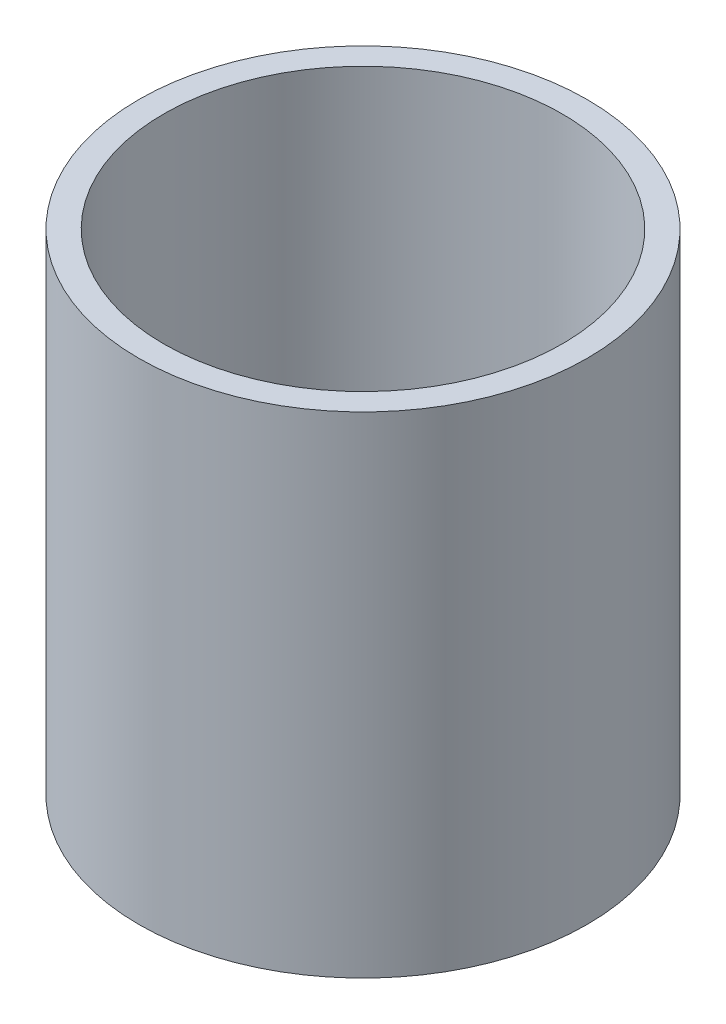
ISO-10303-21;
HEADER;
FILE_DESCRIPTION(('STEP AP214'),'2;1');
FILE_NAME('part.step','',(''),(''),'','','');
FILE_SCHEMA(('AUTOMOTIVE_DESIGN { 1 0 10303 214 1 1 1 1 }'));
ENDSEC;
DATA;
#1=APPLICATION_CONTEXT('core data for automotive mechanical design processes');
#2=APPLICATION_PROTOCOL_DEFINITION('international standard','automotive_design',2000,#1);
#3=PRODUCT_CONTEXT('',#1,'mechanical');
#4=PRODUCT('Part','Part','',(#3));
#5=PRODUCT_RELATED_PRODUCT_CATEGORY('part','',(#4));
#6=PRODUCT_DEFINITION_FORMATION('','',#4);
#7=PRODUCT_DEFINITION_CONTEXT('part definition',#1,'design');
#8=PRODUCT_DEFINITION('design','',#6,#7);
#9=PRODUCT_DEFINITION_SHAPE('','',#8);
#10=(LENGTH_UNIT() NAMED_UNIT(*) SI_UNIT(.MILLI.,.METRE.));
#11=(NAMED_UNIT(*) PLANE_ANGLE_UNIT() SI_UNIT($,.RADIAN.));
#12=(NAMED_UNIT(*) SI_UNIT($,.STERADIAN.) SOLID_ANGLE_UNIT());
#13=UNCERTAINTY_MEASURE_WITH_UNIT(LENGTH_MEASURE(1.E-05),#10,'distance_accuracy_value','');
#14=(GEOMETRIC_REPRESENTATION_CONTEXT(3) GLOBAL_UNCERTAINTY_ASSIGNED_CONTEXT((#13)) GLOBAL_UNIT_ASSIGNED_CONTEXT((#10,
#11,#12)) REPRESENTATION_CONTEXT('',''));
#15=CARTESIAN_POINT('',(0.,0.,0.));
#16=DIRECTION('',(0.,0.,1.));
#17=DIRECTION('',(1.,0.,0.));
#18=AXIS2_PLACEMENT_3D('',#15,#16,#17);
#19=CARTESIAN_POINT('',(0.,50.,0.));
#20=DIRECTION('',(0.,1.,0.));
#21=DIRECTION('',(0.,0.,1.));
#22=AXIS2_PLACEMENT_3D('',#19,#20,#21);
#23=PLANE('',#22);
#24=CARTESIAN_POINT('',(0.,50.,0.));
#25=DIRECTION('',(0.,1.,0.));
#26=DIRECTION('',(0.,0.,1.));
#27=AXIS2_PLACEMENT_3D('',#24,#25,#26);
#28=CIRCLE('',#27,22.86);
#29=CARTESIAN_POINT('',(0.,50.,22.86));
#30=VERTEX_POINT('',#29);
#31=EDGE_CURVE('E10',#30,#30,#28,.T.);
#32=ORIENTED_EDGE('',*,*,#31,.T.);
#33=EDGE_LOOP('',(#32));
#34=FACE_BOUND('',#33,.T.);
#35=CARTESIAN_POINT('',(0.,50.,0.));
#36=DIRECTION('',(0.,1.,0.));
#37=DIRECTION('',(0.,0.,1.));
#38=AXIS2_PLACEMENT_3D('',#35,#36,#37);
#39=CIRCLE('',#38,20.32);
#40=CARTESIAN_POINT('',(0.,50.,20.32));
#41=VERTEX_POINT('',#40);
#42=EDGE_CURVE('E42',#41,#41,#39,.T.);
#43=ORIENTED_EDGE('',*,*,#42,.F.);
#44=EDGE_LOOP('',(#43));
#45=FACE_BOUND('',#44,.T.);
#46=ADVANCED_FACE('F31',(#34,#45),#23,.T.);
#47=CARTESIAN_POINT('',(0.,0.,0.));
#48=DIRECTION('',(0.,1.,0.));
#49=DIRECTION('',(0.,0.,1.));
#50=AXIS2_PLACEMENT_3D('',#47,#48,#49);
#51=PLANE('',#50);
#52=CARTESIAN_POINT('',(0.,0.,0.));
#53=DIRECTION('',(0.,1.,0.));
#54=DIRECTION('',(0.,0.,1.));
#55=AXIS2_PLACEMENT_3D('',#52,#53,#54);
#56=CIRCLE('',#55,22.86);
#57=CARTESIAN_POINT('',(0.,0.,22.86));
#58=VERTEX_POINT('',#57);
#59=EDGE_CURVE('E35',#58,#58,#56,.T.);
#60=ORIENTED_EDGE('',*,*,#59,.F.);
#61=EDGE_LOOP('',(#60));
#62=FACE_BOUND('',#61,.T.);
#63=CARTESIAN_POINT('',(0.,0.,0.));
#64=DIRECTION('',(0.,1.,0.));
#65=DIRECTION('',(0.,0.,1.));
#66=AXIS2_PLACEMENT_3D('',#63,#64,#65);
#67=CIRCLE('',#66,20.32);
#68=CARTESIAN_POINT('',(0.,0.,20.32));
#69=VERTEX_POINT('',#68);
#70=EDGE_CURVE('E44',#69,#69,#67,.T.);
#71=ORIENTED_EDGE('',*,*,#70,.T.);
#72=EDGE_LOOP('',(#71));
#73=FACE_BOUND('',#72,.T.);
#74=ADVANCED_FACE('F54',(#62,#73),#51,.F.);
#75=CARTESIAN_POINT('',(0.,50.,0.));
#76=DIRECTION('',(0.,-1.,0.));
#77=DIRECTION('',(0.,0.,-1.));
#78=AXIS2_PLACEMENT_3D('',#75,#76,#77);
#79=CYLINDRICAL_SURFACE('',#78,22.86);
#80=ORIENTED_EDGE('',*,*,#31,.F.);
#81=EDGE_LOOP('',(#80));
#82=FACE_BOUND('',#81,.T.);
#83=ORIENTED_EDGE('',*,*,#59,.T.);
#84=EDGE_LOOP('',(#83));
#85=FACE_BOUND('',#84,.T.);
#86=ADVANCED_FACE('F33',(#82,#85),#79,.T.);
#87=CARTESIAN_POINT('',(0.,50.,0.));
#88=DIRECTION('',(0.,-1.,0.));
#89=DIRECTION('',(0.,0.,-1.));
#90=AXIS2_PLACEMENT_3D('',#87,#88,#89);
#91=CYLINDRICAL_SURFACE('',#90,20.32);
#92=ORIENTED_EDGE('',*,*,#42,.T.);
#93=EDGE_LOOP('',(#92));
#94=FACE_BOUND('',#93,.T.);
#95=ORIENTED_EDGE('',*,*,#70,.F.);
#96=EDGE_LOOP('',(#95));
#97=FACE_BOUND('',#96,.T.);
#98=ADVANCED_FACE('F50',(#94,#97),#91,.F.);
#99=CLOSED_SHELL('',(#46,#74,#86,#98));
#100=MANIFOLD_SOLID_BREP('B2',#99);
#101=ADVANCED_BREP_SHAPE_REPRESENTATION('',(#18,#100),#14);
#102=SHAPE_DEFINITION_REPRESENTATION(#9,#101);
ENDSEC;
END-ISO-10303-21;
